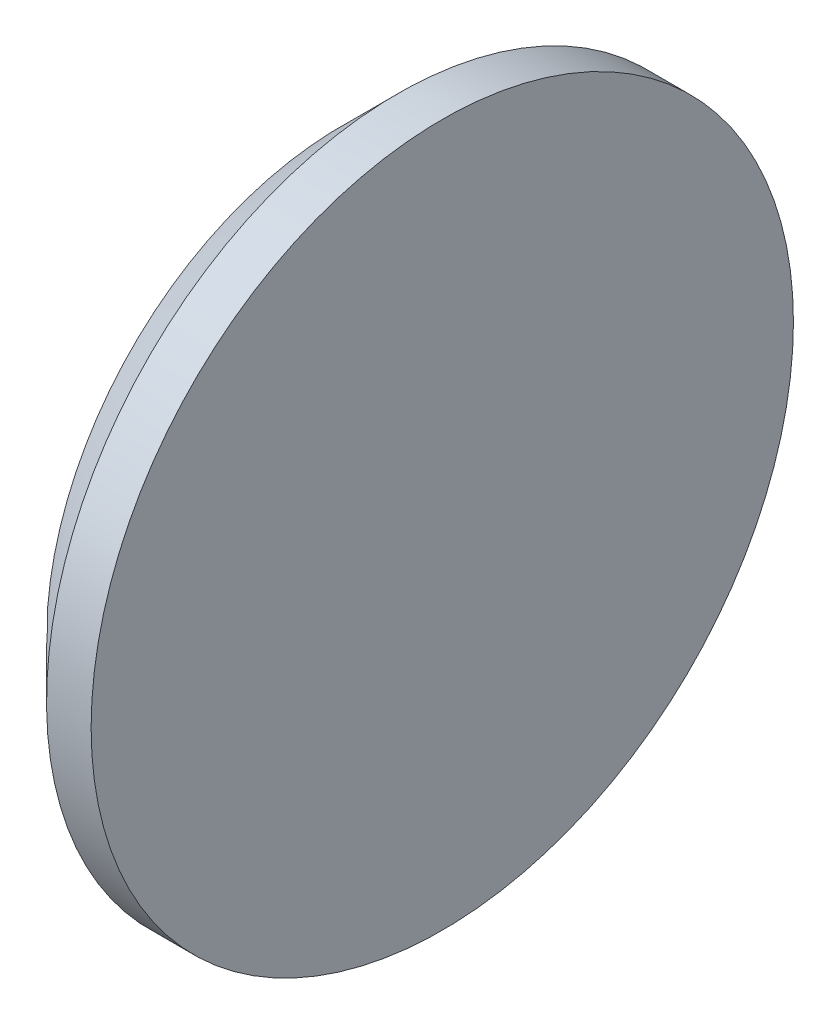
ISO-10303-21;
HEADER;
FILE_DESCRIPTION(('STEP AP214'),'2;1');
FILE_NAME('part.step','',(''),(''),'','','');
FILE_SCHEMA(('AUTOMOTIVE_DESIGN { 1 0 10303 214 1 1 1 1 }'));
ENDSEC;
DATA;
#1=APPLICATION_CONTEXT('core data for automotive mechanical design processes');
#2=APPLICATION_PROTOCOL_DEFINITION('international standard','automotive_design',2000,#1);
#3=PRODUCT_CONTEXT('',#1,'mechanical');
#4=PRODUCT('Part','Part','',(#3));
#5=PRODUCT_RELATED_PRODUCT_CATEGORY('part','',(#4));
#6=PRODUCT_DEFINITION_FORMATION('','',#4);
#7=PRODUCT_DEFINITION_CONTEXT('part definition',#1,'design');
#8=PRODUCT_DEFINITION('design','',#6,#7);
#9=PRODUCT_DEFINITION_SHAPE('','',#8);
#10=(LENGTH_UNIT() NAMED_UNIT(*) SI_UNIT(.MILLI.,.METRE.));
#11=(NAMED_UNIT(*) PLANE_ANGLE_UNIT() SI_UNIT($,.RADIAN.));
#12=(NAMED_UNIT(*) SI_UNIT($,.STERADIAN.) SOLID_ANGLE_UNIT());
#13=UNCERTAINTY_MEASURE_WITH_UNIT(LENGTH_MEASURE(1.E-05),#10,'distance_accuracy_value','');
#14=(GEOMETRIC_REPRESENTATION_CONTEXT(3) GLOBAL_UNCERTAINTY_ASSIGNED_CONTEXT((#13)) GLOBAL_UNIT_ASSIGNED_CONTEXT((#10,
#11,#12)) REPRESENTATION_CONTEXT('',''));
#15=CARTESIAN_POINT('',(0.,0.,0.));
#16=DIRECTION('',(0.,0.,1.));
#17=DIRECTION('',(1.,0.,0.));
#18=AXIS2_PLACEMENT_3D('',#15,#16,#17);
#19=CARTESIAN_POINT('',(-21.6413814338446,-87.8984870846084,77.6217666361628));
#20=DIRECTION('',(-1.,0.,0.));
#21=DIRECTION('',(0.,0.,-1.));
#22=AXIS2_PLACEMENT_3D('',#19,#20,#21);
#23=PLANE('',#22);
#24=CARTESIAN_POINT('',(-21.6413814338446,-87.8984870846084,77.6217666361628));
#25=DIRECTION('',(1.,0.,0.));
#26=DIRECTION('',(0.,0.,-1.));
#27=AXIS2_PLACEMENT_3D('',#24,#25,#26);
#28=CIRCLE('',#27,5.3);
#29=CARTESIAN_POINT('',(-21.6413814338446,-88.3579604955615,82.9018124867807));
#30=VERTEX_POINT('',#29);
#31=CARTESIAN_POINT('',(-21.6413814338446,-88.3579604955615,72.3417207855449));
#32=VERTEX_POINT('',#31);
#33=EDGE_CURVE('E207',#30,#32,#28,.T.);
#34=ORIENTED_EDGE('',*,*,#33,.F.);
#35=DIRECTION('',(0.,0.,-1.));
#36=VECTOR('',#35,1.);
#37=CARTESIAN_POINT('',(-21.6413814338446,-88.3579604955615,82.2275168703384));
#38=LINE('',#37,#36);
#39=EDGE_CURVE('E212',#30,#32,#38,.T.);
#40=ORIENTED_EDGE('',*,*,#39,.T.);
#41=EDGE_LOOP('',(#34,#40));
#42=FACE_BOUND('',#41,.T.);
#43=ADVANCED_FACE('F36',(#42),#23,.T.);
#44=CARTESIAN_POINT('',(-21.6413814338446,-87.8984870846084,77.6217666361628));
#45=DIRECTION('',(1.,0.,0.));
#46=DIRECTION('',(0.,0.,1.));
#47=AXIS2_PLACEMENT_3D('',#44,#45,#46);
#48=CYLINDRICAL_SURFACE('',#47,6.3);
#49=CARTESIAN_POINT('',(-20.6413814338446,-87.8984870846084,77.6217666361628));
#50=DIRECTION('',(1.,0.,0.));
#51=DIRECTION('',(0.,0.,-1.));
#52=AXIS2_PLACEMENT_3D('',#49,#50,#51);
#53=CIRCLE('',#52,6.3);
#54=CARTESIAN_POINT('',(-20.6413814338446,-87.8984870846084,71.3217666361628));
#55=VERTEX_POINT('',#54);
#56=EDGE_CURVE('E201',#55,#55,#53,.F.);
#57=ORIENTED_EDGE('',*,*,#56,.F.);
#58=EDGE_LOOP('',(#57));
#59=FACE_BOUND('',#58,.T.);
#60=CARTESIAN_POINT('',(-19.8413814338446,-87.8984870846084,77.6217666361628));
#61=DIRECTION('',(1.,0.,0.));
#62=DIRECTION('',(0.,0.,-1.));
#63=AXIS2_PLACEMENT_3D('',#60,#61,#62);
#64=CIRCLE('',#63,6.3);
#65=CARTESIAN_POINT('',(-19.8413814338446,-87.8984870846084,71.3217666361628));
#66=VERTEX_POINT('',#65);
#67=EDGE_CURVE('E208',#66,#66,#64,.T.);
#68=ORIENTED_EDGE('',*,*,#67,.F.);
#69=EDGE_LOOP('',(#68));
#70=FACE_BOUND('',#69,.T.);
#71=ADVANCED_FACE('F251',(#59,#70),#48,.T.);
#72=DIRECTION('',(0.,0.,1.));
#73=VECTOR('',#72,1.);
#74=CARTESIAN_POINT('',(-21.6413814338446,-87.4390136736553,82.2275168703384));
#75=LINE('',#74,#73);
#76=CARTESIAN_POINT('',(-21.6413814338446,-87.4390136736553,72.3417207855449));
#77=VERTEX_POINT('',#76);
#78=CARTESIAN_POINT('',(-21.6413814338446,-87.4390136736553,82.9018124867807));
#79=VERTEX_POINT('',#78);
#80=EDGE_CURVE('E215',#77,#79,#75,.T.);
#81=ORIENTED_EDGE('',*,*,#80,.T.);
#82=EDGE_CURVE('E204',#77,#79,#28,.T.);
#83=ORIENTED_EDGE('',*,*,#82,.F.);
#84=EDGE_LOOP('',(#81,#83));
#85=FACE_BOUND('',#84,.T.);
#86=ADVANCED_FACE('F254',(#85),#23,.T.);
#87=CARTESIAN_POINT('',(-19.8413814338446,-87.8984870846084,77.6217666361628));
#88=DIRECTION('',(-1.,0.,0.));
#89=DIRECTION('',(0.,0.,-1.));
#90=AXIS2_PLACEMENT_3D('',#87,#88,#89);
#91=PLANE('',#90);
#92=ORIENTED_EDGE('',*,*,#67,.T.);
#93=EDGE_LOOP('',(#92));
#94=FACE_BOUND('',#93,.T.);
#95=ADVANCED_FACE('F263',(#94),#91,.F.);
#96=CARTESIAN_POINT('',(-21.6413814338446,-87.8984870846084,77.6217666361628));
#97=DIRECTION('',(1.,0.,0.));
#98=DIRECTION('',(0.,0.,1.));
#99=AXIS2_PLACEMENT_3D('',#96,#97,#98);
#100=CONICAL_SURFACE('',#99,5.3,0.785398163397451);
#101=CARTESIAN_POINT('',(-23.7598386069064,-88.3579604955615,74.4735768476861));
#102=CARTESIAN_POINT('',(-23.5413395100147,-88.3579604955615,74.2528003483087));
#103=CARTESIAN_POINT('',(-23.322638756559,-88.3579604955615,74.0322237902477));
#104=CARTESIAN_POINT('',(-22.8849547416179,-88.3579604955615,73.5913513726595));
#105=CARTESIAN_POINT('',(-22.6659714803163,-88.3579604955615,73.3710555129498));
#106=CARTESIAN_POINT('',(-22.2278431764605,-88.3579604955615,72.9306252283891));
#107=CARTESIAN_POINT('',(-22.0086981340588,-88.3579604955615,72.7104908033864));
#108=CARTESIAN_POINT('',(-21.570295781487,-88.3579604955615,72.2703336960238));
#109=CARTESIAN_POINT('',(-21.3510384712975,-88.3579604955615,72.0503110136834));
#110=CARTESIAN_POINT('',(-20.821525757279,-88.3579604955615,71.5191336844602));
#111=CARTESIAN_POINT('',(-20.5112322643197,-88.3579604955615,71.2080170127084));
#112=CARTESIAN_POINT('',(-19.8905428411355,-88.3579604955615,70.5858854920264));
#113=CARTESIAN_POINT('',(-19.5801469108494,-88.3579604955615,70.2748706431573));
#114=CARTESIAN_POINT('',(-19.2697248646637,-88.3579604955615,69.9638818955778));
#115=B_SPLINE_CURVE_WITH_KNOTS('',3,(#101,#102,#103,#104,#105,#106,#107,#108,#109,#110,#111,
#112,#113,#114),.UNSPECIFIED.,.F.,.F.,(4,2,2,2,2,2,4),(0.,0.931856287412407,1.86371196867853,
2.79556677260741,3.72742173824926,5.04563289078031,6.36384483236455),.UNSPECIFIED.);
#116=CARTESIAN_POINT('',(-21.3829307871978,-88.3579604955615,72.0823390686396));
#117=VERTEX_POINT('',#116);
#118=EDGE_CURVE('E62',#32,#117,#115,.T.);
#119=ORIENTED_EDGE('',*,*,#118,.T.);
#120=CARTESIAN_POINT('',(-21.1113218320905,-89.7162706757352,72.0823390686396));
#121=CARTESIAN_POINT('',(-21.1546882789121,-89.5772841006569,72.0823390686396));
#122=CARTESIAN_POINT('',(-21.1939319505298,-89.4369396751909,72.0823390686396));
#123=CARTESIAN_POINT('',(-21.2631431016877,-89.1538331243948,72.0823390686396));
#124=CARTESIAN_POINT('',(-21.2931006130407,-89.0110685733193,72.0823390686396));
#125=CARTESIAN_POINT('',(-21.3420402216385,-88.7270342557744,72.0823390686396));
#126=CARTESIAN_POINT('',(-21.3612596190349,-88.5858060094958,72.0823390686396));
#127=CARTESIAN_POINT('',(-21.3890394296635,-88.3023691437256,72.0823390686396));
#128=CARTESIAN_POINT('',(-21.3976050832586,-88.1601610408475,72.0823390686396));
#129=CARTESIAN_POINT('',(-21.404148919324,-87.856118189471,72.0823390686396));
#130=CARTESIAN_POINT('',(-21.4005275836855,-87.6942462571922,72.0823390686396));
#131=CARTESIAN_POINT('',(-21.3792633571836,-87.3713220328574,72.0823390686396));
#132=CARTESIAN_POINT('',(-21.3616101148039,-87.2102704342799,72.0823390686396));
#133=CARTESIAN_POINT('',(-21.3125080275252,-86.8859092188599,72.0823390686396));
#134=CARTESIAN_POINT('',(-21.2807022606697,-86.7226547008538,72.0823390686396));
#135=CARTESIAN_POINT('',(-21.2048199583258,-86.3992376328418,72.0823390686396));
#136=CARTESIAN_POINT('',(-21.1607600180134,-86.2390712122892,72.0823390686396));
#137=CARTESIAN_POINT('',(-21.1113218320905,-86.0807034934816,72.0823390686396));
#138=B_SPLINE_CURVE_WITH_KNOTS('',3,(#120,#121,#122,#123,#124,#125,#126,#127,#128,#129,#130,
#131,#132,#133,#134,#135,#136,#137),.UNSPECIFIED.,.F.,.F.,(4,2,2,2,2,2,2,2,4),(0.,
0.436823834406533,0.874114964457058,1.30131589723275,1.72830661522969,2.21340746111182,
2.6988665045698,3.19733128177472,3.69512427426542),.UNSPECIFIED.);
#139=CARTESIAN_POINT('',(-21.3829307871978,-87.4390136736553,72.0823390686396));
#140=VERTEX_POINT('',#139);
#141=EDGE_CURVE('E11',#117,#140,#138,.T.);
#142=ORIENTED_EDGE('',*,*,#141,.T.);
#143=CARTESIAN_POINT('',(-19.2697248646637,-87.4390136736553,69.9638818955778));
#144=CARTESIAN_POINT('',(-19.6443715048233,-87.4390136736553,70.3392211276707));
#145=CARTESIAN_POINT('',(-20.018986343973,-87.4390136736553,70.7145921582188));
#146=CARTESIAN_POINT('',(-20.7680514379656,-87.4390136736553,71.4654977601779));
#147=CARTESIAN_POINT('',(-21.1425016929457,-87.4390136736553,71.8410323314521));
#148=CARTESIAN_POINT('',(-21.8911376038686,-87.4390136736553,72.5923659280882));
#149=CARTESIAN_POINT('',(-22.2653232595696,-87.4390136736553,72.9681649536911));
#150=CARTESIAN_POINT('',(-22.8261983445489,-87.4390136736553,73.5322650520476));
#151=CARTESIAN_POINT('',(-23.0130895536075,-87.4390136736553,73.7203654260141));
#152=CARTESIAN_POINT('',(-23.386651236978,-87.4390136736553,74.096785406323));
#153=CARTESIAN_POINT('',(-23.5733217111675,-87.4390136736553,74.285105012787));
#154=CARTESIAN_POINT('',(-23.7598386069064,-87.4390136736553,74.4735768476861));
#155=B_SPLINE_CURVE_WITH_KNOTS('',3,(#143,#144,#145,#146,#147,#148,#149,#150,#151,#152,#153,
#154),.UNSPECIFIED.,.F.,.F.,(4,2,2,2,2,4),(0.,1.59096101896142,3.18192070960964,4.7728818522657,
5.56836310956232,6.36384480804414),.UNSPECIFIED.);
#156=EDGE_CURVE('E138',#140,#77,#155,.T.);
#157=ORIENTED_EDGE('',*,*,#156,.T.);
#158=ORIENTED_EDGE('',*,*,#82,.T.);
#159=CARTESIAN_POINT('',(-23.8146481000015,-87.4390136736553,80.7145559153722));
#160=CARTESIAN_POINT('',(-23.5999533061199,-87.4390136736553,80.9315689008336));
#161=CARTESIAN_POINT('',(-23.385053172579,-87.4390136736553,81.148378355229));
#162=CARTESIAN_POINT('',(-22.9549652771295,-87.4390136736553,81.5817115417122));
#163=CARTESIAN_POINT('',(-22.739777515423,-87.4390136736553,81.7982352740003));
#164=CARTESIAN_POINT('',(-22.3092373302253,-87.4390136736553,82.231118441846));
#165=CARTESIAN_POINT('',(-22.0938849069006,-87.4390136736553,82.4474778775692));
#166=CARTESIAN_POINT('',(-21.6630656764679,-87.4390136736553,82.8800829212865));
#167=CARTESIAN_POINT('',(-21.447598869338,-87.4390136736553,83.0963285292588));
#168=CARTESIAN_POINT('',(-20.8909076076956,-87.4390136736553,83.6548327584025));
#169=CARTESIAN_POINT('',(-20.5496250874731,-87.4390136736553,83.9970334936885));
#170=CARTESIAN_POINT('',(-19.8669351764464,-87.4390136736553,84.6813108790986));
#171=CARTESIAN_POINT('',(-19.5255277855532,-87.4390136736553,85.023387529134));
#172=CARTESIAN_POINT('',(-19.1840923771817,-87.4390136736553,85.3654361599254));
#173=B_SPLINE_CURVE_WITH_KNOTS('',3,(#159,#160,#161,#162,#163,#164,#165,#166,#167,#168,#169,
#170,#171,#172),.UNSPECIFIED.,.F.,.F.,(4,2,2,2,2,2,4),(0.,0.915803176333,1.8316057097895,
2.74740731838024,3.66320910199944,5.11309730420093,6.56298654159516),.UNSPECIFIED.);
#174=CARTESIAN_POINT('',(-21.3520609195607,-87.4390136736553,83.1921694937685));
#175=VERTEX_POINT('',#174);
#176=EDGE_CURVE('E173',#79,#175,#173,.T.);
#177=ORIENTED_EDGE('',*,*,#176,.T.);
#178=CARTESIAN_POINT('',(-21.0818827197743,-86.0807034934816,83.1921694937685));
#179=CARTESIAN_POINT('',(-21.1252684802955,-86.2204518259374,83.1921694937685));
#180=CARTESIAN_POINT('',(-21.1644978427558,-86.3615621637182,83.1921694937685));
#181=CARTESIAN_POINT('',(-21.2336121768661,-86.6462008469104,83.1921694937685));
#182=CARTESIAN_POINT('',(-21.2634872089001,-86.7897315947193,83.1921694937685));
#183=CARTESIAN_POINT('',(-21.3121992612362,-87.0752915319587,83.1921694937685));
#184=CARTESIAN_POINT('',(-21.3312739220635,-87.2172795560419,83.1921694937685));
#185=CARTESIAN_POINT('',(-21.3587012590932,-87.5022233967931,83.1921694937685));
#186=CARTESIAN_POINT('',(-21.3670591887467,-87.6451787047111,83.1921694937685));
#187=CARTESIAN_POINT('',(-21.3730705680087,-87.9492239362019,83.1921694937685));
#188=CARTESIAN_POINT('',(-21.3692540846872,-88.1103452471009,83.1921694937685));
#189=CARTESIAN_POINT('',(-21.3478121050108,-88.4317667432341,83.1921694937685));
#190=CARTESIAN_POINT('',(-21.3301767327833,-88.5920662586608,83.1921694937685));
#191=CARTESIAN_POINT('',(-21.2813168293531,-88.9148715479443,83.1921694937685));
#192=CARTESIAN_POINT('',(-21.2497458944295,-89.0773238738007,83.1921694937685));
#193=CARTESIAN_POINT('',(-21.1745046117361,-89.3991937461158,83.1921694937685));
#194=CARTESIAN_POINT('',(-21.1308502000792,-89.5586149961401,83.1921694937685));
#195=CARTESIAN_POINT('',(-21.0818827197743,-89.7162706757352,83.1921694937685));
#196=B_SPLINE_CURVE_WITH_KNOTS('',3,(#178,#179,#180,#181,#182,#183,#184,#185,#186,#187,#188,
#189,#190,#191,#192,#193,#194,#195),.UNSPECIFIED.,.F.,.F.,(4,2,2,2,2,2,2,2,4),(0.,
0.439022721587676,0.878510364097451,1.30790933694473,1.73709773345756,2.21997762500149,
2.70320292886761,3.19918313120416,3.69451230873043),.UNSPECIFIED.);
#197=CARTESIAN_POINT('',(-21.3520609195607,-88.3579604955615,83.1921694937685));
#198=VERTEX_POINT('',#197);
#199=EDGE_CURVE('E50',#175,#198,#196,.T.);
#200=ORIENTED_EDGE('',*,*,#199,.T.);
#201=CARTESIAN_POINT('',(-19.1840923771817,-88.3579604955615,85.3654361599254));
#202=CARTESIAN_POINT('',(-19.5704698351883,-88.3579604955615,84.9783586940025));
#203=CARTESIAN_POINT('',(-19.9568155801793,-88.3579604955615,84.5912495129155));
#204=CARTESIAN_POINT('',(-20.7293357533951,-88.3579604955615,83.8168609543791));
#205=CARTESIAN_POINT('',(-21.1155101817729,-88.3579604955615,83.4295815770822));
#206=CARTESIAN_POINT('',(-21.8875809103722,-88.3579604955615,82.6547447788748));
#207=CARTESIAN_POINT('',(-22.273477210314,-88.3579604955615,82.2671873576856));
#208=CARTESIAN_POINT('',(-22.8518882510518,-88.3579604955615,81.6854197846797));
#209=CARTESIAN_POINT('',(-23.0446197860792,-88.3579604955615,81.4914252630407));
#210=CARTESIAN_POINT('',(-23.4298403638357,-88.3579604955615,81.1031954048165));
#211=CARTESIAN_POINT('',(-23.622329406412,-88.3579604955615,80.9089600680798));
#212=CARTESIAN_POINT('',(-23.8146481000014,-88.3579604955615,80.7145559153723));
#213=B_SPLINE_CURVE_WITH_KNOTS('',3,(#201,#202,#203,#204,#205,#206,#207,#208,#209,#210,#211,
#212),.UNSPECIFIED.,.F.,.F.,(4,2,2,2,2,4),(0.,1.6407463924974,3.28149131678614,4.92223788789943,
5.7426119374655,6.56298650395991),.UNSPECIFIED.);
#214=EDGE_CURVE('E166',#198,#30,#213,.T.);
#215=ORIENTED_EDGE('',*,*,#214,.T.);
#216=ORIENTED_EDGE('',*,*,#33,.T.);
#217=EDGE_LOOP('',(#119,#142,#157,#158,#177,#200,#215,#216));
#218=FACE_BOUND('',#217,.T.);
#219=ORIENTED_EDGE('',*,*,#56,.T.);
#220=EDGE_LOOP('',(#219));
#221=FACE_BOUND('',#220,.T.);
#222=ADVANCED_FACE('F38',(#218,#221),#100,.T.);
#223=CARTESIAN_POINT('',(-21.1413814338446,-88.3579604955615,82.2275168703384));
#224=DIRECTION('',(0.,-1.,0.));
#225=DIRECTION('',(-1.,0.,0.));
#226=AXIS2_PLACEMENT_3D('',#223,#224,#225);
#227=PLANE('',#226);
#228=ORIENTED_EDGE('',*,*,#39,.F.);
#229=ORIENTED_EDGE('',*,*,#214,.F.);
#230=DIRECTION('',(-1.,0.,0.));
#231=VECTOR('',#230,1.);
#232=CARTESIAN_POINT('',(-20.6413814338446,-88.3579604955615,83.1921694937685));
#233=LINE('',#232,#231);
#234=CARTESIAN_POINT('',(-20.6413814338446,-88.3579604955615,83.1921694937685));
#235=VERTEX_POINT('',#234);
#236=EDGE_CURVE('E157',#235,#198,#233,.T.);
#237=ORIENTED_EDGE('',*,*,#236,.F.);
#238=DIRECTION('',(0.,0.,-1.));
#239=VECTOR('',#238,1.);
#240=CARTESIAN_POINT('',(-20.6413814338446,-88.3579604955615,81.2628642469084));
#241=LINE('',#240,#239);
#242=CARTESIAN_POINT('',(-20.6413814338446,-88.3579604955615,81.2628642469084));
#243=VERTEX_POINT('',#242);
#244=EDGE_CURVE('E149',#235,#243,#241,.T.);
#245=ORIENTED_EDGE('',*,*,#244,.T.);
#246=DIRECTION('',(-1.,0.,0.));
#247=VECTOR('',#246,1.);
#248=CARTESIAN_POINT('',(-20.6413814338446,-88.3579604955615,81.2628642469084));
#249=LINE('',#248,#247);
#250=CARTESIAN_POINT('',(-21.1413814338446,-88.3579604955615,81.2628642469084));
#251=VERTEX_POINT('',#250);
#252=EDGE_CURVE('E162',#243,#251,#249,.T.);
#253=ORIENTED_EDGE('',*,*,#252,.T.);
#254=DIRECTION('',(0.,0.,-1.));
#255=VECTOR('',#254,1.);
#256=CARTESIAN_POINT('',(-21.1413814338446,-88.3579604955615,82.2275168703384));
#257=LINE('',#256,#255);
#258=CARTESIAN_POINT('',(-21.1413814338446,-88.3579604955615,73.9496937353346));
#259=VERTEX_POINT('',#258);
#260=EDGE_CURVE('E211',#251,#259,#257,.T.);
#261=ORIENTED_EDGE('',*,*,#260,.T.);
#262=DIRECTION('',(-1.,0.,0.));
#263=VECTOR('',#262,1.);
#264=CARTESIAN_POINT('',(-20.6413814338446,-88.3579604955615,73.9496937353346));
#265=LINE('',#264,#263);
#266=CARTESIAN_POINT('',(-20.6413814338446,-88.3579604955615,73.9496937353346));
#267=VERTEX_POINT('',#266);
#268=EDGE_CURVE('E142',#267,#259,#265,.T.);
#269=ORIENTED_EDGE('',*,*,#268,.F.);
#270=DIRECTION('',(0.,0.,-1.));
#271=VECTOR('',#270,1.);
#272=CARTESIAN_POINT('',(-20.6413814338446,-88.3579604955615,73.9496937353346));
#273=LINE('',#272,#271);
#274=CARTESIAN_POINT('',(-20.6413814338446,-88.3579604955615,72.0823390686396));
#275=VERTEX_POINT('',#274);
#276=EDGE_CURVE('E140',#267,#275,#273,.T.);
#277=ORIENTED_EDGE('',*,*,#276,.T.);
#278=DIRECTION('',(-1.,0.,0.));
#279=VECTOR('',#278,1.);
#280=CARTESIAN_POINT('',(-20.6413814338446,-88.3579604955615,72.0823390686396));
#281=LINE('',#280,#279);
#282=EDGE_CURVE('E57',#275,#117,#281,.T.);
#283=ORIENTED_EDGE('',*,*,#282,.T.);
#284=ORIENTED_EDGE('',*,*,#118,.F.);
#285=EDGE_LOOP('',(#228,#229,#237,#245,#253,#261,#269,#277,#283,#284));
#286=FACE_BOUND('',#285,.T.);
#287=ADVANCED_FACE('F277',(#286),#227,.F.);
#288=CARTESIAN_POINT('',(-21.1413814338446,-87.4390136736553,82.2275168703384));
#289=DIRECTION('',(0.,1.,0.));
#290=DIRECTION('',(1.,0.,0.));
#291=AXIS2_PLACEMENT_3D('',#288,#289,#290);
#292=PLANE('',#291);
#293=ORIENTED_EDGE('',*,*,#156,.F.);
#294=DIRECTION('',(-1.,0.,0.));
#295=VECTOR('',#294,1.);
#296=CARTESIAN_POINT('',(-20.6413814338446,-87.4390136736553,72.0823390686396));
#297=LINE('',#296,#295);
#298=CARTESIAN_POINT('',(-20.6413814338446,-87.4390136736553,72.0823390686396));
#299=VERTEX_POINT('',#298);
#300=EDGE_CURVE('E122',#299,#140,#297,.T.);
#301=ORIENTED_EDGE('',*,*,#300,.F.);
#302=DIRECTION('',(0.,0.,1.));
#303=VECTOR('',#302,1.);
#304=CARTESIAN_POINT('',(-20.6413814338446,-87.4390136736553,73.9496937353346));
#305=LINE('',#304,#303);
#306=CARTESIAN_POINT('',(-20.6413814338446,-87.4390136736553,73.9496937353346));
#307=VERTEX_POINT('',#306);
#308=EDGE_CURVE('E126',#299,#307,#305,.T.);
#309=ORIENTED_EDGE('',*,*,#308,.T.);
#310=DIRECTION('',(-1.,0.,0.));
#311=VECTOR('',#310,1.);
#312=CARTESIAN_POINT('',(-20.6413814338446,-87.4390136736553,73.9496937353346));
#313=LINE('',#312,#311);
#314=CARTESIAN_POINT('',(-21.1413814338446,-87.4390136736553,73.9496937353346));
#315=VERTEX_POINT('',#314);
#316=EDGE_CURVE('E139',#307,#315,#313,.T.);
#317=ORIENTED_EDGE('',*,*,#316,.T.);
#318=DIRECTION('',(0.,0.,1.));
#319=VECTOR('',#318,1.);
#320=CARTESIAN_POINT('',(-21.1413814338446,-87.4390136736553,82.2275168703384));
#321=LINE('',#320,#319);
#322=CARTESIAN_POINT('',(-21.1413814338446,-87.4390136736553,81.2628642469084));
#323=VERTEX_POINT('',#322);
#324=EDGE_CURVE('E214',#315,#323,#321,.T.);
#325=ORIENTED_EDGE('',*,*,#324,.T.);
#326=DIRECTION('',(-1.,0.,0.));
#327=VECTOR('',#326,1.);
#328=CARTESIAN_POINT('',(-20.6413814338446,-87.4390136736553,81.2628642469084));
#329=LINE('',#328,#327);
#330=CARTESIAN_POINT('',(-20.6413814338446,-87.4390136736553,81.2628642469084));
#331=VERTEX_POINT('',#330);
#332=EDGE_CURVE('E159',#331,#323,#329,.T.);
#333=ORIENTED_EDGE('',*,*,#332,.F.);
#334=DIRECTION('',(0.,0.,1.));
#335=VECTOR('',#334,1.);
#336=CARTESIAN_POINT('',(-20.6413814338446,-87.4390136736553,81.2628642469084));
#337=LINE('',#336,#335);
#338=CARTESIAN_POINT('',(-20.6413814338446,-87.4390136736553,83.1921694937685));
#339=VERTEX_POINT('',#338);
#340=EDGE_CURVE('E154',#331,#339,#337,.T.);
#341=ORIENTED_EDGE('',*,*,#340,.T.);
#342=DIRECTION('',(-1.,0.,0.));
#343=VECTOR('',#342,1.);
#344=CARTESIAN_POINT('',(-20.6413814338446,-87.4390136736553,83.1921694937685));
#345=LINE('',#344,#343);
#346=EDGE_CURVE('E127',#339,#175,#345,.T.);
#347=ORIENTED_EDGE('',*,*,#346,.T.);
#348=ORIENTED_EDGE('',*,*,#176,.F.);
#349=ORIENTED_EDGE('',*,*,#80,.F.);
#350=EDGE_LOOP('',(#293,#301,#309,#317,#325,#333,#341,#347,#348,#349));
#351=FACE_BOUND('',#350,.T.);
#352=ADVANCED_FACE('F136',(#351),#292,.F.);
#353=CARTESIAN_POINT('',(-21.1413814338446,0.,0.));
#354=DIRECTION('',(-1.,0.,0.));
#355=DIRECTION('',(0.,0.,-1.));
#356=AXIS2_PLACEMENT_3D('',#353,#354,#355);
#357=PLANE('',#356);
#358=DIRECTION('',(0.,-1.,0.));
#359=VECTOR('',#358,1.);
#360=CARTESIAN_POINT('',(-21.1413814338446,0.,73.9496937353346));
#361=LINE('',#360,#359);
#362=EDGE_CURVE('E197',#315,#259,#361,.T.);
#363=ORIENTED_EDGE('',*,*,#362,.T.);
#364=ORIENTED_EDGE('',*,*,#260,.F.);
#365=DIRECTION('',(0.,1.,0.));
#366=VECTOR('',#365,1.);
#367=CARTESIAN_POINT('',(-21.1413814338446,0.,81.2628642469084));
#368=LINE('',#367,#366);
#369=EDGE_CURVE('E199',#251,#323,#368,.T.);
#370=ORIENTED_EDGE('',*,*,#369,.T.);
#371=ORIENTED_EDGE('',*,*,#324,.F.);
#372=EDGE_LOOP('',(#363,#364,#370,#371));
#373=FACE_BOUND('',#372,.T.);
#374=ADVANCED_FACE('F188',(#373),#357,.T.);
#375=CARTESIAN_POINT('',(-20.6413814338446,-87.4390136736553,83.1921694937685));
#376=DIRECTION('',(0.,0.,1.));
#377=DIRECTION('',(-1.,0.,0.));
#378=AXIS2_PLACEMENT_3D('',#375,#376,#377);
#379=PLANE('',#378);
#380=ORIENTED_EDGE('',*,*,#199,.F.);
#381=ORIENTED_EDGE('',*,*,#346,.F.);
#382=DIRECTION('',(0.,-1.,0.));
#383=VECTOR('',#382,1.);
#384=CARTESIAN_POINT('',(-20.6413814338446,-87.4390136736553,83.1921694937685));
#385=LINE('',#384,#383);
#386=EDGE_CURVE('E147',#339,#235,#385,.T.);
#387=ORIENTED_EDGE('',*,*,#386,.T.);
#388=ORIENTED_EDGE('',*,*,#236,.T.);
#389=EDGE_LOOP('',(#380,#381,#387,#388));
#390=FACE_BOUND('',#389,.T.);
#391=ADVANCED_FACE('F184',(#390),#379,.F.);
#392=CARTESIAN_POINT('',(-20.6413814338446,-87.4390136736553,81.2628642469084));
#393=DIRECTION('',(0.,0.,-1.));
#394=DIRECTION('',(1.,0.,0.));
#395=AXIS2_PLACEMENT_3D('',#392,#393,#394);
#396=PLANE('',#395);
#397=ORIENTED_EDGE('',*,*,#369,.F.);
#398=ORIENTED_EDGE('',*,*,#252,.F.);
#399=DIRECTION('',(0.,1.,0.));
#400=VECTOR('',#399,1.);
#401=CARTESIAN_POINT('',(-20.6413814338446,-87.4390136736553,81.2628642469084));
#402=LINE('',#401,#400);
#403=EDGE_CURVE('E152',#243,#331,#402,.T.);
#404=ORIENTED_EDGE('',*,*,#403,.T.);
#405=ORIENTED_EDGE('',*,*,#332,.T.);
#406=EDGE_LOOP('',(#397,#398,#404,#405));
#407=FACE_BOUND('',#406,.T.);
#408=ADVANCED_FACE('F183',(#407),#396,.F.);
#409=CARTESIAN_POINT('',(-20.6413814338446,0.,0.));
#410=DIRECTION('',(1.,0.,0.));
#411=DIRECTION('',(0.,0.,1.));
#412=AXIS2_PLACEMENT_3D('',#409,#410,#411);
#413=PLANE('',#412);
#414=ORIENTED_EDGE('',*,*,#386,.F.);
#415=ORIENTED_EDGE('',*,*,#340,.F.);
#416=ORIENTED_EDGE('',*,*,#403,.F.);
#417=ORIENTED_EDGE('',*,*,#244,.F.);
#418=EDGE_LOOP('',(#414,#415,#416,#417));
#419=FACE_BOUND('',#418,.T.);
#420=ADVANCED_FACE('F242',(#419),#413,.F.);
#421=CARTESIAN_POINT('',(-20.6413814338446,-87.4390136736553,72.0823390686396));
#422=DIRECTION('',(0.,0.,-1.));
#423=DIRECTION('',(1.,0.,0.));
#424=AXIS2_PLACEMENT_3D('',#421,#422,#423);
#425=PLANE('',#424);
#426=ORIENTED_EDGE('',*,*,#141,.F.);
#427=ORIENTED_EDGE('',*,*,#282,.F.);
#428=DIRECTION('',(0.,1.,0.));
#429=VECTOR('',#428,1.);
#430=CARTESIAN_POINT('',(-20.6413814338446,-87.4390136736553,72.0823390686396));
#431=LINE('',#430,#429);
#432=EDGE_CURVE('E118',#275,#299,#431,.T.);
#433=ORIENTED_EDGE('',*,*,#432,.T.);
#434=ORIENTED_EDGE('',*,*,#300,.T.);
#435=EDGE_LOOP('',(#426,#427,#433,#434));
#436=FACE_BOUND('',#435,.T.);
#437=ADVANCED_FACE('F120',(#436),#425,.F.);
#438=CARTESIAN_POINT('',(-20.6413814338446,-87.4390136736553,73.9496937353346));
#439=DIRECTION('',(0.,0.,1.));
#440=DIRECTION('',(-1.,0.,0.));
#441=AXIS2_PLACEMENT_3D('',#438,#439,#440);
#442=PLANE('',#441);
#443=ORIENTED_EDGE('',*,*,#362,.F.);
#444=ORIENTED_EDGE('',*,*,#316,.F.);
#445=DIRECTION('',(0.,-1.,0.));
#446=VECTOR('',#445,1.);
#447=CARTESIAN_POINT('',(-20.6413814338446,-87.4390136736553,73.9496937353346));
#448=LINE('',#447,#446);
#449=EDGE_CURVE('E131',#307,#267,#448,.T.);
#450=ORIENTED_EDGE('',*,*,#449,.T.);
#451=ORIENTED_EDGE('',*,*,#268,.T.);
#452=EDGE_LOOP('',(#443,#444,#450,#451));
#453=FACE_BOUND('',#452,.T.);
#454=ADVANCED_FACE('F235',(#453),#442,.F.);
#455=CARTESIAN_POINT('',(-20.6413814338446,0.,0.));
#456=DIRECTION('',(-1.,0.,0.));
#457=DIRECTION('',(0.,0.,-1.));
#458=AXIS2_PLACEMENT_3D('',#455,#456,#457);
#459=PLANE('',#458);
#460=ORIENTED_EDGE('',*,*,#432,.F.);
#461=ORIENTED_EDGE('',*,*,#276,.F.);
#462=ORIENTED_EDGE('',*,*,#449,.F.);
#463=ORIENTED_EDGE('',*,*,#308,.F.);
#464=EDGE_LOOP('',(#460,#461,#462,#463));
#465=FACE_BOUND('',#464,.T.);
#466=ADVANCED_FACE('F130',(#465),#459,.T.);
#467=CLOSED_SHELL('',(#43,#71,#86,#95,#222,#287,#352,#374,#391,#408,#420,#437,#454,#466));
#468=MANIFOLD_SOLID_BREP('B2',#467);
#469=ADVANCED_BREP_SHAPE_REPRESENTATION('',(#18,#468),#14);
#470=SHAPE_DEFINITION_REPRESENTATION(#9,#469);
ENDSEC;
END-ISO-10303-21;
